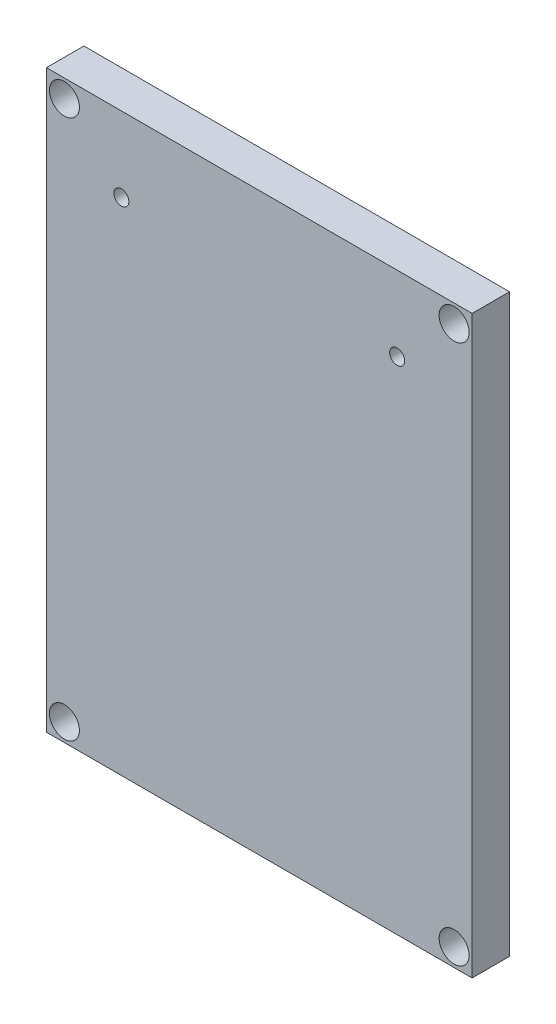
ISO-10303-21;
HEADER;
FILE_DESCRIPTION(('STEP AP214'),'2;1');
FILE_NAME('part.step','',(''),(''),'','','');
FILE_SCHEMA(('AUTOMOTIVE_DESIGN { 1 0 10303 214 1 1 1 1 }'));
ENDSEC;
DATA;
#1=APPLICATION_CONTEXT('core data for automotive mechanical design processes');
#2=APPLICATION_PROTOCOL_DEFINITION('international standard','automotive_design',2000,#1);
#3=PRODUCT_CONTEXT('',#1,'mechanical');
#4=PRODUCT('Part','Part','',(#3));
#5=PRODUCT_RELATED_PRODUCT_CATEGORY('part','',(#4));
#6=PRODUCT_DEFINITION_FORMATION('','',#4);
#7=PRODUCT_DEFINITION_CONTEXT('part definition',#1,'design');
#8=PRODUCT_DEFINITION('design','',#6,#7);
#9=PRODUCT_DEFINITION_SHAPE('','',#8);
#10=(LENGTH_UNIT() NAMED_UNIT(*) SI_UNIT(.MILLI.,.METRE.));
#11=(NAMED_UNIT(*) PLANE_ANGLE_UNIT() SI_UNIT($,.RADIAN.));
#12=(NAMED_UNIT(*) SI_UNIT($,.STERADIAN.) SOLID_ANGLE_UNIT());
#13=UNCERTAINTY_MEASURE_WITH_UNIT(LENGTH_MEASURE(1.E-05),#10,'distance_accuracy_value','');
#14=(GEOMETRIC_REPRESENTATION_CONTEXT(3) GLOBAL_UNCERTAINTY_ASSIGNED_CONTEXT((#13)) GLOBAL_UNIT_ASSIGNED_CONTEXT((#10,
#11,#12)) REPRESENTATION_CONTEXT('',''));
#15=CARTESIAN_POINT('',(0.,0.,0.));
#16=DIRECTION('',(0.,0.,1.));
#17=DIRECTION('',(1.,0.,0.));
#18=AXIS2_PLACEMENT_3D('',#15,#16,#17);
#19=CARTESIAN_POINT('',(0.,0.,6.35));
#20=DIRECTION('',(1.,0.,0.));
#21=DIRECTION('',(0.,1.,0.));
#22=AXIS2_PLACEMENT_3D('',#19,#20,#21);
#23=PLANE('',#22);
#24=DIRECTION('',(0.,-1.,0.));
#25=VECTOR('',#24,1.);
#26=CARTESIAN_POINT('',(0.,0.,0.));
#27=LINE('',#26,#25);
#28=CARTESIAN_POINT('',(0.,0.,0.));
#29=VERTEX_POINT('',#28);
#30=CARTESIAN_POINT('',(0.,-97.536,0.));
#31=VERTEX_POINT('',#30);
#32=EDGE_CURVE('E102',#29,#31,#27,.T.);
#33=ORIENTED_EDGE('',*,*,#32,.T.);
#34=DIRECTION('',(0.,0.,-1.));
#35=VECTOR('',#34,1.);
#36=CARTESIAN_POINT('',(0.,-97.536,6.35));
#37=LINE('',#36,#35);
#38=CARTESIAN_POINT('',(0.,-97.536,6.35));
#39=VERTEX_POINT('',#38);
#40=EDGE_CURVE('E11',#39,#31,#37,.T.);
#41=ORIENTED_EDGE('',*,*,#40,.F.);
#42=DIRECTION('',(0.,-1.,0.));
#43=VECTOR('',#42,1.);
#44=CARTESIAN_POINT('',(0.,0.,6.35));
#45=LINE('',#44,#43);
#46=CARTESIAN_POINT('',(0.,0.,6.35));
#47=VERTEX_POINT('',#46);
#48=EDGE_CURVE('E90',#47,#39,#45,.T.);
#49=ORIENTED_EDGE('',*,*,#48,.F.);
#50=DIRECTION('',(0.,0.,-1.));
#51=VECTOR('',#50,1.);
#52=CARTESIAN_POINT('',(0.,0.,6.35));
#53=LINE('',#52,#51);
#54=EDGE_CURVE('E98',#47,#29,#53,.T.);
#55=ORIENTED_EDGE('',*,*,#54,.T.);
#56=EDGE_LOOP('',(#33,#41,#49,#55));
#57=FACE_BOUND('',#56,.T.);
#58=ADVANCED_FACE('F39',(#57),#23,.F.);
#59=CARTESIAN_POINT('',(0.,-97.536,6.35));
#60=DIRECTION('',(0.,1.,0.));
#61=DIRECTION('',(0.,0.,1.));
#62=AXIS2_PLACEMENT_3D('',#59,#60,#61);
#63=PLANE('',#62);
#64=DIRECTION('',(1.,0.,0.));
#65=VECTOR('',#64,1.);
#66=CARTESIAN_POINT('',(0.,-97.536,0.));
#67=LINE('',#66,#65);
#68=CARTESIAN_POINT('',(72.136,-97.536,0.));
#69=VERTEX_POINT('',#68);
#70=EDGE_CURVE('E94',#31,#69,#67,.T.);
#71=ORIENTED_EDGE('',*,*,#70,.T.);
#72=DIRECTION('',(0.,0.,-1.));
#73=VECTOR('',#72,1.);
#74=CARTESIAN_POINT('',(72.136,-97.536,6.35));
#75=LINE('',#74,#73);
#76=CARTESIAN_POINT('',(72.136,-97.536,6.35));
#77=VERTEX_POINT('',#76);
#78=EDGE_CURVE('E47',#77,#69,#75,.T.);
#79=ORIENTED_EDGE('',*,*,#78,.F.);
#80=DIRECTION('',(1.,0.,0.));
#81=VECTOR('',#80,1.);
#82=CARTESIAN_POINT('',(0.,-97.536,6.35));
#83=LINE('',#82,#81);
#84=EDGE_CURVE('E85',#39,#77,#83,.T.);
#85=ORIENTED_EDGE('',*,*,#84,.F.);
#86=ORIENTED_EDGE('',*,*,#40,.T.);
#87=EDGE_LOOP('',(#71,#79,#85,#86));
#88=FACE_BOUND('',#87,.T.);
#89=ADVANCED_FACE('F93',(#88),#63,.F.);
#90=CARTESIAN_POINT('',(72.136,0.,6.35));
#91=DIRECTION('',(-1.,0.,0.));
#92=DIRECTION('',(0.,-1.,0.));
#93=AXIS2_PLACEMENT_3D('',#90,#91,#92);
#94=PLANE('',#93);
#95=DIRECTION('',(0.,1.,0.));
#96=VECTOR('',#95,1.);
#97=CARTESIAN_POINT('',(72.136,0.,0.));
#98=LINE('',#97,#96);
#99=CARTESIAN_POINT('',(72.136,0.,0.));
#100=VERTEX_POINT('',#99);
#101=EDGE_CURVE('E72',#69,#100,#98,.T.);
#102=ORIENTED_EDGE('',*,*,#101,.T.);
#103=DIRECTION('',(0.,0.,-1.));
#104=VECTOR('',#103,1.);
#105=CARTESIAN_POINT('',(72.136,0.,6.35));
#106=LINE('',#105,#104);
#107=CARTESIAN_POINT('',(72.136,0.,6.35));
#108=VERTEX_POINT('',#107);
#109=EDGE_CURVE('E95',#108,#100,#106,.T.);
#110=ORIENTED_EDGE('',*,*,#109,.F.);
#111=DIRECTION('',(0.,1.,0.));
#112=VECTOR('',#111,1.);
#113=CARTESIAN_POINT('',(72.136,0.,6.35));
#114=LINE('',#113,#112);
#115=EDGE_CURVE('E88',#77,#108,#114,.T.);
#116=ORIENTED_EDGE('',*,*,#115,.F.);
#117=ORIENTED_EDGE('',*,*,#78,.T.);
#118=EDGE_LOOP('',(#102,#110,#116,#117));
#119=FACE_BOUND('',#118,.T.);
#120=ADVANCED_FACE('F96',(#119),#94,.F.);
#121=CARTESIAN_POINT('',(0.,0.,6.35));
#122=DIRECTION('',(0.,-1.,0.));
#123=DIRECTION('',(0.,0.,-1.));
#124=AXIS2_PLACEMENT_3D('',#121,#122,#123);
#125=PLANE('',#124);
#126=DIRECTION('',(-1.,0.,0.));
#127=VECTOR('',#126,1.);
#128=CARTESIAN_POINT('',(0.,0.,0.));
#129=LINE('',#128,#127);
#130=EDGE_CURVE('E78',#100,#29,#129,.T.);
#131=ORIENTED_EDGE('',*,*,#130,.T.);
#132=ORIENTED_EDGE('',*,*,#54,.F.);
#133=DIRECTION('',(-1.,0.,0.));
#134=VECTOR('',#133,1.);
#135=CARTESIAN_POINT('',(0.,0.,6.35));
#136=LINE('',#135,#134);
#137=EDGE_CURVE('E55',#108,#47,#136,.T.);
#138=ORIENTED_EDGE('',*,*,#137,.F.);
#139=ORIENTED_EDGE('',*,*,#109,.T.);
#140=EDGE_LOOP('',(#131,#132,#138,#139));
#141=FACE_BOUND('',#140,.T.);
#142=ADVANCED_FACE('F110',(#141),#125,.F.);
#143=CARTESIAN_POINT('',(0.,0.,6.35));
#144=DIRECTION('',(0.,0.,1.));
#145=DIRECTION('',(1.,0.,0.));
#146=AXIS2_PLACEMENT_3D('',#143,#144,#145);
#147=PLANE('',#146);
#148=CARTESIAN_POINT('',(12.7,-12.7,6.35));
#149=DIRECTION('',(0.,0.,1.));
#150=DIRECTION('',(1.,0.,0.));
#151=AXIS2_PLACEMENT_3D('',#148,#149,#150);
#152=CIRCLE('',#151,1.27);
#153=CARTESIAN_POINT('',(13.97,-12.7,6.35));
#154=VERTEX_POINT('',#153);
#155=EDGE_CURVE('E146',#154,#154,#152,.T.);
#156=ORIENTED_EDGE('',*,*,#155,.F.);
#157=EDGE_LOOP('',(#156));
#158=FACE_BOUND('',#157,.T.);
#159=CARTESIAN_POINT('',(59.436,-12.7,6.35));
#160=DIRECTION('',(0.,0.,1.));
#161=DIRECTION('',(1.,0.,0.));
#162=AXIS2_PLACEMENT_3D('',#159,#160,#161);
#163=CIRCLE('',#162,1.27);
#164=CARTESIAN_POINT('',(60.706,-12.7,6.35));
#165=VERTEX_POINT('',#164);
#166=EDGE_CURVE('E143',#165,#165,#163,.T.);
#167=ORIENTED_EDGE('',*,*,#166,.F.);
#168=EDGE_LOOP('',(#167));
#169=FACE_BOUND('',#168,.T.);
#170=CARTESIAN_POINT('',(3.048,-94.488,6.35));
#171=DIRECTION('',(0.,0.,1.));
#172=DIRECTION('',(1.,0.,0.));
#173=AXIS2_PLACEMENT_3D('',#170,#171,#172);
#174=CIRCLE('',#173,2.54);
#175=CARTESIAN_POINT('',(5.588,-94.488,6.35));
#176=VERTEX_POINT('',#175);
#177=EDGE_CURVE('E122',#176,#176,#174,.T.);
#178=ORIENTED_EDGE('',*,*,#177,.F.);
#179=EDGE_LOOP('',(#178));
#180=FACE_BOUND('',#179,.T.);
#181=CARTESIAN_POINT('',(69.088,-94.488,6.35));
#182=DIRECTION('',(0.,0.,1.));
#183=DIRECTION('',(1.,0.,0.));
#184=AXIS2_PLACEMENT_3D('',#181,#182,#183);
#185=CIRCLE('',#184,2.53999999999999);
#186=CARTESIAN_POINT('',(71.628,-94.488,6.35));
#187=VERTEX_POINT('',#186);
#188=EDGE_CURVE('E130',#187,#187,#185,.T.);
#189=ORIENTED_EDGE('',*,*,#188,.F.);
#190=EDGE_LOOP('',(#189));
#191=FACE_BOUND('',#190,.T.);
#192=CARTESIAN_POINT('',(69.088,-3.048,6.35));
#193=DIRECTION('',(0.,0.,1.));
#194=DIRECTION('',(1.,0.,0.));
#195=AXIS2_PLACEMENT_3D('',#192,#193,#194);
#196=CIRCLE('',#195,2.54);
#197=CARTESIAN_POINT('',(71.628,-3.048,6.35));
#198=VERTEX_POINT('',#197);
#199=EDGE_CURVE('E121',#198,#198,#196,.T.);
#200=ORIENTED_EDGE('',*,*,#199,.F.);
#201=EDGE_LOOP('',(#200));
#202=FACE_BOUND('',#201,.T.);
#203=CARTESIAN_POINT('',(3.048,-3.048,6.35));
#204=DIRECTION('',(0.,0.,1.));
#205=DIRECTION('',(1.,0.,0.));
#206=AXIS2_PLACEMENT_3D('',#203,#204,#205);
#207=CIRCLE('',#206,2.54);
#208=CARTESIAN_POINT('',(5.588,-3.048,6.35));
#209=VERTEX_POINT('',#208);
#210=EDGE_CURVE('E118',#209,#209,#207,.T.);
#211=ORIENTED_EDGE('',*,*,#210,.F.);
#212=EDGE_LOOP('',(#211));
#213=FACE_BOUND('',#212,.T.);
#214=ORIENTED_EDGE('',*,*,#48,.T.);
#215=ORIENTED_EDGE('',*,*,#84,.T.);
#216=ORIENTED_EDGE('',*,*,#115,.T.);
#217=ORIENTED_EDGE('',*,*,#137,.T.);
#218=EDGE_LOOP('',(#214,#215,#216,#217));
#219=FACE_BOUND('',#218,.T.);
#220=ADVANCED_FACE('F86',(#158,#169,#180,#191,#202,#213,#219),#147,.T.);
#221=CARTESIAN_POINT('',(0.,0.,0.));
#222=DIRECTION('',(0.,0.,1.));
#223=DIRECTION('',(1.,0.,0.));
#224=AXIS2_PLACEMENT_3D('',#221,#222,#223);
#225=PLANE('',#224);
#226=CARTESIAN_POINT('',(3.048,-94.488,0.));
#227=DIRECTION('',(0.,0.,1.));
#228=DIRECTION('',(1.,0.,0.));
#229=AXIS2_PLACEMENT_3D('',#226,#227,#228);
#230=CIRCLE('',#229,2.54);
#231=CARTESIAN_POINT('',(5.588,-94.488,0.));
#232=VERTEX_POINT('',#231);
#233=EDGE_CURVE('E126',#232,#232,#230,.F.);
#234=ORIENTED_EDGE('',*,*,#233,.F.);
#235=EDGE_LOOP('',(#234));
#236=FACE_BOUND('',#235,.T.);
#237=CARTESIAN_POINT('',(69.088,-94.488,0.));
#238=DIRECTION('',(0.,0.,1.));
#239=DIRECTION('',(1.,0.,0.));
#240=AXIS2_PLACEMENT_3D('',#237,#238,#239);
#241=CIRCLE('',#240,2.53999999999999);
#242=CARTESIAN_POINT('',(71.628,-94.488,0.));
#243=VERTEX_POINT('',#242);
#244=EDGE_CURVE('E125',#243,#243,#241,.F.);
#245=ORIENTED_EDGE('',*,*,#244,.F.);
#246=EDGE_LOOP('',(#245));
#247=FACE_BOUND('',#246,.T.);
#248=CARTESIAN_POINT('',(69.088,-3.048,0.));
#249=DIRECTION('',(0.,0.,1.));
#250=DIRECTION('',(1.,0.,0.));
#251=AXIS2_PLACEMENT_3D('',#248,#249,#250);
#252=CIRCLE('',#251,2.54);
#253=CARTESIAN_POINT('',(71.628,-3.048,0.));
#254=VERTEX_POINT('',#253);
#255=EDGE_CURVE('E133',#254,#254,#252,.F.);
#256=ORIENTED_EDGE('',*,*,#255,.F.);
#257=EDGE_LOOP('',(#256));
#258=FACE_BOUND('',#257,.T.);
#259=CARTESIAN_POINT('',(3.048,-3.048,0.));
#260=DIRECTION('',(0.,0.,1.));
#261=DIRECTION('',(1.,0.,0.));
#262=AXIS2_PLACEMENT_3D('',#259,#260,#261);
#263=CIRCLE('',#262,2.54);
#264=CARTESIAN_POINT('',(5.588,-3.048,0.));
#265=VERTEX_POINT('',#264);
#266=EDGE_CURVE('E105',#265,#265,#263,.F.);
#267=ORIENTED_EDGE('',*,*,#266,.F.);
#268=EDGE_LOOP('',(#267));
#269=FACE_BOUND('',#268,.T.);
#270=ORIENTED_EDGE('',*,*,#32,.F.);
#271=ORIENTED_EDGE('',*,*,#130,.F.);
#272=ORIENTED_EDGE('',*,*,#101,.F.);
#273=ORIENTED_EDGE('',*,*,#70,.F.);
#274=EDGE_LOOP('',(#270,#271,#272,#273));
#275=FACE_BOUND('',#274,.T.);
#276=ADVANCED_FACE('F113',(#236,#247,#258,#269,#275),#225,.F.);
#277=CARTESIAN_POINT('',(3.048,-3.048,-0.00100000000000013));
#278=DIRECTION('',(0.,0.,1.));
#279=DIRECTION('',(1.,0.,0.));
#280=AXIS2_PLACEMENT_3D('',#277,#278,#279);
#281=CYLINDRICAL_SURFACE('',#280,2.54);
#282=ORIENTED_EDGE('',*,*,#210,.T.);
#283=EDGE_LOOP('',(#282));
#284=FACE_BOUND('',#283,.T.);
#285=ORIENTED_EDGE('',*,*,#266,.T.);
#286=EDGE_LOOP('',(#285));
#287=FACE_BOUND('',#286,.T.);
#288=ADVANCED_FACE('F174',(#284,#287),#281,.F.);
#289=CARTESIAN_POINT('',(69.088,-3.048,-0.00100000000000013));
#290=DIRECTION('',(0.,0.,1.));
#291=DIRECTION('',(1.,0.,0.));
#292=AXIS2_PLACEMENT_3D('',#289,#290,#291);
#293=CYLINDRICAL_SURFACE('',#292,2.54);
#294=ORIENTED_EDGE('',*,*,#199,.T.);
#295=EDGE_LOOP('',(#294));
#296=FACE_BOUND('',#295,.T.);
#297=ORIENTED_EDGE('',*,*,#255,.T.);
#298=EDGE_LOOP('',(#297));
#299=FACE_BOUND('',#298,.T.);
#300=ADVANCED_FACE('F177',(#296,#299),#293,.F.);
#301=CARTESIAN_POINT('',(69.088,-94.488,-0.00100000000000013));
#302=DIRECTION('',(0.,0.,1.));
#303=DIRECTION('',(1.,0.,0.));
#304=AXIS2_PLACEMENT_3D('',#301,#302,#303);
#305=CYLINDRICAL_SURFACE('',#304,2.53999999999999);
#306=ORIENTED_EDGE('',*,*,#188,.T.);
#307=EDGE_LOOP('',(#306));
#308=FACE_BOUND('',#307,.T.);
#309=ORIENTED_EDGE('',*,*,#244,.T.);
#310=EDGE_LOOP('',(#309));
#311=FACE_BOUND('',#310,.T.);
#312=ADVANCED_FACE('F237',(#308,#311),#305,.F.);
#313=CARTESIAN_POINT('',(3.048,-94.488,-0.00100000000000013));
#314=DIRECTION('',(0.,0.,1.));
#315=DIRECTION('',(1.,0.,0.));
#316=AXIS2_PLACEMENT_3D('',#313,#314,#315);
#317=CYLINDRICAL_SURFACE('',#316,2.54);
#318=ORIENTED_EDGE('',*,*,#177,.T.);
#319=EDGE_LOOP('',(#318));
#320=FACE_BOUND('',#319,.T.);
#321=ORIENTED_EDGE('',*,*,#233,.T.);
#322=EDGE_LOOP('',(#321));
#323=FACE_BOUND('',#322,.T.);
#324=ADVANCED_FACE('F246',(#320,#323),#317,.F.);
#325=CARTESIAN_POINT('',(59.436,-12.7,2.54));
#326=DIRECTION('',(0.,0.,1.));
#327=DIRECTION('',(1.,0.,0.));
#328=AXIS2_PLACEMENT_3D('',#325,#326,#327);
#329=CYLINDRICAL_SURFACE('',#328,1.27);
#330=CARTESIAN_POINT('',(59.436,-12.7,2.54));
#331=DIRECTION('',(0.,0.,1.));
#332=DIRECTION('',(1.,0.,0.));
#333=AXIS2_PLACEMENT_3D('',#330,#331,#332);
#334=CIRCLE('',#333,1.27);
#335=CARTESIAN_POINT('',(60.706,-12.7,2.54));
#336=VERTEX_POINT('',#335);
#337=EDGE_CURVE('E140',#336,#336,#334,.T.);
#338=CARTESIAN_POINT('',(60.706,-12.7,2.54));
#339=CARTESIAN_POINT('',(60.706,-12.7,2.5796875));
#340=CARTESIAN_POINT('',(60.706,-12.7,2.619375));
#341=CARTESIAN_POINT('',(60.706,-12.7,2.69875));
#342=CARTESIAN_POINT('',(60.706,-12.7,2.7384375));
#343=CARTESIAN_POINT('',(60.706,-12.7,2.8178125));
#344=CARTESIAN_POINT('',(60.706,-12.7,2.8575));
#345=CARTESIAN_POINT('',(60.706,-12.7,2.936875));
#346=CARTESIAN_POINT('',(60.706,-12.7,2.9765625));
#347=CARTESIAN_POINT('',(60.706,-12.7,3.0559375));
#348=CARTESIAN_POINT('',(60.706,-12.7,3.095625));
#349=CARTESIAN_POINT('',(60.706,-12.7,3.175));
#350=CARTESIAN_POINT('',(60.706,-12.7,3.2146875));
#351=CARTESIAN_POINT('',(60.706,-12.7,3.2940625));
#352=CARTESIAN_POINT('',(60.706,-12.7,3.33375));
#353=CARTESIAN_POINT('',(60.706,-12.7,3.413125));
#354=CARTESIAN_POINT('',(60.706,-12.7,3.4528125));
#355=CARTESIAN_POINT('',(60.706,-12.7,3.5321875));
#356=CARTESIAN_POINT('',(60.706,-12.7,3.571875));
#357=CARTESIAN_POINT('',(60.706,-12.7,3.65125));
#358=CARTESIAN_POINT('',(60.706,-12.7,3.6909375));
#359=CARTESIAN_POINT('',(60.706,-12.7,3.7703125));
#360=CARTESIAN_POINT('',(60.706,-12.7,3.81));
#361=CARTESIAN_POINT('',(60.706,-12.7,3.889375));
#362=CARTESIAN_POINT('',(60.706,-12.7,3.9290625));
#363=CARTESIAN_POINT('',(60.706,-12.7,4.0084375));
#364=CARTESIAN_POINT('',(60.706,-12.7,4.048125));
#365=CARTESIAN_POINT('',(60.706,-12.7,4.1275));
#366=CARTESIAN_POINT('',(60.706,-12.7,4.1671875));
#367=CARTESIAN_POINT('',(60.706,-12.7,4.2465625));
#368=CARTESIAN_POINT('',(60.706,-12.7,4.28625));
#369=CARTESIAN_POINT('',(60.706,-12.7,4.365625));
#370=CARTESIAN_POINT('',(60.706,-12.7,4.4053125));
#371=CARTESIAN_POINT('',(60.706,-12.7,4.4846875));
#372=CARTESIAN_POINT('',(60.706,-12.7,4.524375));
#373=CARTESIAN_POINT('',(60.706,-12.7,4.60375));
#374=CARTESIAN_POINT('',(60.706,-12.7,4.6434375));
#375=CARTESIAN_POINT('',(60.706,-12.7,4.7228125));
#376=CARTESIAN_POINT('',(60.706,-12.7,4.7625));
#377=CARTESIAN_POINT('',(60.706,-12.7,4.841875));
#378=CARTESIAN_POINT('',(60.706,-12.7,4.8815625));
#379=CARTESIAN_POINT('',(60.706,-12.7,4.9609375));
#380=CARTESIAN_POINT('',(60.706,-12.7,5.000625));
#381=CARTESIAN_POINT('',(60.706,-12.7,5.08));
#382=CARTESIAN_POINT('',(60.706,-12.7,5.1196875));
#383=CARTESIAN_POINT('',(60.706,-12.7,5.1990625));
#384=CARTESIAN_POINT('',(60.706,-12.7,5.23875));
#385=CARTESIAN_POINT('',(60.706,-12.7,5.318125));
#386=CARTESIAN_POINT('',(60.706,-12.7,5.3578125));
#387=CARTESIAN_POINT('',(60.706,-12.7,5.4371875));
#388=CARTESIAN_POINT('',(60.706,-12.7,5.476875));
#389=CARTESIAN_POINT('',(60.706,-12.7,5.55625));
#390=CARTESIAN_POINT('',(60.706,-12.7,5.5959375));
#391=CARTESIAN_POINT('',(60.706,-12.7,5.6753125));
#392=CARTESIAN_POINT('',(60.706,-12.7,5.715));
#393=CARTESIAN_POINT('',(60.706,-12.7,5.794375));
#394=CARTESIAN_POINT('',(60.706,-12.7,5.8340625));
#395=CARTESIAN_POINT('',(60.706,-12.7,5.9134375));
#396=CARTESIAN_POINT('',(60.706,-12.7,5.953125));
#397=CARTESIAN_POINT('',(60.706,-12.7,6.0325));
#398=CARTESIAN_POINT('',(60.706,-12.7,6.0721875));
#399=CARTESIAN_POINT('',(60.706,-12.7,6.1515625));
#400=CARTESIAN_POINT('',(60.706,-12.7,6.19125));
#401=CARTESIAN_POINT('',(60.706,-12.7,6.270625));
#402=CARTESIAN_POINT('',(60.706,-12.7,6.3103125));
#403=CARTESIAN_POINT('',(60.706,-12.7,6.35));
#404=B_SPLINE_CURVE_WITH_KNOTS('',3,(#338,#339,#340,#341,#342,#343,#344,#345,#346,#347,#348,
#349,#350,#351,#352,#353,#354,#355,#356,#357,#358,#359,#360,#361,#362,#363,#364,#365,#366,#367,
#368,#369,#370,#371,#372,#373,#374,#375,#376,#377,#378,#379,#380,#381,#382,#383,#384,#385,#386,
#387,#388,#389,#390,#391,#392,#393,#394,#395,#396,#397,#398,#399,#400,#401,#402,#403),
.UNSPECIFIED.,.F.,.F.,(4,2,2,2,2,2,2,2,2,2,2,2,2,2,2,2,2,2,2,2,2,2,2,2,2,2,2,2,2,2,2,2,4),(0.,
0.1190625,0.238125,0.3571875,0.47625,0.5953125,0.714375,0.8334375,0.9525,1.0715625,1.190625,
1.3096875,1.42875,1.5478125,1.666875,1.7859375,1.905,2.0240625,2.143125,2.2621875,2.38125,
2.5003125,2.619375,2.7384375,2.8575,2.9765625,3.095625,3.2146875,3.33375,3.4528125,3.571875,
3.6909375,3.81),.UNSPECIFIED.);
#405=EDGE_CURVE('BSEAM255',#336,#165,#404,.T.);
#406=ORIENTED_EDGE('',*,*,#337,.F.);
#407=ORIENTED_EDGE('',*,*,#166,.T.);
#408=ORIENTED_EDGE('',*,*,#405,.T.);
#409=ORIENTED_EDGE('',*,*,#405,.F.);
#410=EDGE_LOOP('',(#406,#408,#407,#409));
#411=FACE_BOUND('',#410,.T.);
#412=ADVANCED_FACE('F255',(#411),#329,.F.);
#413=CARTESIAN_POINT('',(59.436,-12.7,2.54));
#414=DIRECTION('',(0.,0.,1.));
#415=DIRECTION('',(1.,0.,0.));
#416=AXIS2_PLACEMENT_3D('',#413,#414,#415);
#417=PLANE('',#416);
#418=ORIENTED_EDGE('',*,*,#337,.T.);
#419=EDGE_LOOP('',(#418));
#420=FACE_BOUND('',#419,.T.);
#421=ADVANCED_FACE('F157',(#420),#417,.T.);
#422=CARTESIAN_POINT('',(12.7,-12.7,2.54));
#423=DIRECTION('',(0.,0.,1.));
#424=DIRECTION('',(1.,0.,0.));
#425=AXIS2_PLACEMENT_3D('',#422,#423,#424);
#426=CYLINDRICAL_SURFACE('',#425,1.27);
#427=CARTESIAN_POINT('',(12.7,-12.7,2.54));
#428=DIRECTION('',(0.,0.,1.));
#429=DIRECTION('',(1.,0.,0.));
#430=AXIS2_PLACEMENT_3D('',#427,#428,#429);
#431=CIRCLE('',#430,1.27);
#432=CARTESIAN_POINT('',(13.97,-12.7,2.54));
#433=VERTEX_POINT('',#432);
#434=EDGE_CURVE('E129',#433,#433,#431,.T.);
#435=CARTESIAN_POINT('',(13.97,-12.7,2.54));
#436=CARTESIAN_POINT('',(13.97,-12.7,2.5796875));
#437=CARTESIAN_POINT('',(13.97,-12.7,2.619375));
#438=CARTESIAN_POINT('',(13.97,-12.7,2.69875));
#439=CARTESIAN_POINT('',(13.97,-12.7,2.7384375));
#440=CARTESIAN_POINT('',(13.97,-12.7,2.8178125));
#441=CARTESIAN_POINT('',(13.97,-12.7,2.8575));
#442=CARTESIAN_POINT('',(13.97,-12.7,2.936875));
#443=CARTESIAN_POINT('',(13.97,-12.7,2.9765625));
#444=CARTESIAN_POINT('',(13.97,-12.7,3.0559375));
#445=CARTESIAN_POINT('',(13.97,-12.7,3.095625));
#446=CARTESIAN_POINT('',(13.97,-12.7,3.175));
#447=CARTESIAN_POINT('',(13.97,-12.7,3.2146875));
#448=CARTESIAN_POINT('',(13.97,-12.7,3.2940625));
#449=CARTESIAN_POINT('',(13.97,-12.7,3.33375));
#450=CARTESIAN_POINT('',(13.97,-12.7,3.413125));
#451=CARTESIAN_POINT('',(13.97,-12.7,3.4528125));
#452=CARTESIAN_POINT('',(13.97,-12.7,3.5321875));
#453=CARTESIAN_POINT('',(13.97,-12.7,3.571875));
#454=CARTESIAN_POINT('',(13.97,-12.7,3.65125));
#455=CARTESIAN_POINT('',(13.97,-12.7,3.6909375));
#456=CARTESIAN_POINT('',(13.97,-12.7,3.7703125));
#457=CARTESIAN_POINT('',(13.97,-12.7,3.81));
#458=CARTESIAN_POINT('',(13.97,-12.7,3.889375));
#459=CARTESIAN_POINT('',(13.97,-12.7,3.9290625));
#460=CARTESIAN_POINT('',(13.97,-12.7,4.0084375));
#461=CARTESIAN_POINT('',(13.97,-12.7,4.048125));
#462=CARTESIAN_POINT('',(13.97,-12.7,4.1275));
#463=CARTESIAN_POINT('',(13.97,-12.7,4.1671875));
#464=CARTESIAN_POINT('',(13.97,-12.7,4.2465625));
#465=CARTESIAN_POINT('',(13.97,-12.7,4.28625));
#466=CARTESIAN_POINT('',(13.97,-12.7,4.365625));
#467=CARTESIAN_POINT('',(13.97,-12.7,4.4053125));
#468=CARTESIAN_POINT('',(13.97,-12.7,4.4846875));
#469=CARTESIAN_POINT('',(13.97,-12.7,4.524375));
#470=CARTESIAN_POINT('',(13.97,-12.7,4.60375));
#471=CARTESIAN_POINT('',(13.97,-12.7,4.6434375));
#472=CARTESIAN_POINT('',(13.97,-12.7,4.7228125));
#473=CARTESIAN_POINT('',(13.97,-12.7,4.7625));
#474=CARTESIAN_POINT('',(13.97,-12.7,4.841875));
#475=CARTESIAN_POINT('',(13.97,-12.7,4.8815625));
#476=CARTESIAN_POINT('',(13.97,-12.7,4.9609375));
#477=CARTESIAN_POINT('',(13.97,-12.7,5.000625));
#478=CARTESIAN_POINT('',(13.97,-12.7,5.08));
#479=CARTESIAN_POINT('',(13.97,-12.7,5.1196875));
#480=CARTESIAN_POINT('',(13.97,-12.7,5.1990625));
#481=CARTESIAN_POINT('',(13.97,-12.7,5.23875));
#482=CARTESIAN_POINT('',(13.97,-12.7,5.318125));
#483=CARTESIAN_POINT('',(13.97,-12.7,5.3578125));
#484=CARTESIAN_POINT('',(13.97,-12.7,5.4371875));
#485=CARTESIAN_POINT('',(13.97,-12.7,5.476875));
#486=CARTESIAN_POINT('',(13.97,-12.7,5.55625));
#487=CARTESIAN_POINT('',(13.97,-12.7,5.5959375));
#488=CARTESIAN_POINT('',(13.97,-12.7,5.6753125));
#489=CARTESIAN_POINT('',(13.97,-12.7,5.715));
#490=CARTESIAN_POINT('',(13.97,-12.7,5.794375));
#491=CARTESIAN_POINT('',(13.97,-12.7,5.8340625));
#492=CARTESIAN_POINT('',(13.97,-12.7,5.9134375));
#493=CARTESIAN_POINT('',(13.97,-12.7,5.953125));
#494=CARTESIAN_POINT('',(13.97,-12.7,6.0325));
#495=CARTESIAN_POINT('',(13.97,-12.7,6.0721875));
#496=CARTESIAN_POINT('',(13.97,-12.7,6.1515625));
#497=CARTESIAN_POINT('',(13.97,-12.7,6.19125));
#498=CARTESIAN_POINT('',(13.97,-12.7,6.270625));
#499=CARTESIAN_POINT('',(13.97,-12.7,6.3103125));
#500=CARTESIAN_POINT('',(13.97,-12.7,6.35));
#501=B_SPLINE_CURVE_WITH_KNOTS('',3,(#435,#436,#437,#438,#439,#440,#441,#442,#443,#444,#445,
#446,#447,#448,#449,#450,#451,#452,#453,#454,#455,#456,#457,#458,#459,#460,#461,#462,#463,#464,
#465,#466,#467,#468,#469,#470,#471,#472,#473,#474,#475,#476,#477,#478,#479,#480,#481,#482,#483,
#484,#485,#486,#487,#488,#489,#490,#491,#492,#493,#494,#495,#496,#497,#498,#499,#500),
.UNSPECIFIED.,.F.,.F.,(4,2,2,2,2,2,2,2,2,2,2,2,2,2,2,2,2,2,2,2,2,2,2,2,2,2,2,2,2,2,2,2,4),(0.,
0.1190625,0.238125,0.3571875,0.47625,0.5953125,0.714375,0.8334375,0.9525,1.0715625,1.190625,
1.3096875,1.42875,1.5478125,1.666875,1.7859375,1.905,2.0240625,2.143125,2.2621875,2.38125,
2.5003125,2.619375,2.7384375,2.8575,2.9765625,3.095625,3.2146875,3.33375,3.4528125,3.571875,
3.6909375,3.81),.UNSPECIFIED.);
#502=EDGE_CURVE('BSEAM154',#433,#154,#501,.T.);
#503=ORIENTED_EDGE('',*,*,#434,.F.);
#504=ORIENTED_EDGE('',*,*,#155,.T.);
#505=ORIENTED_EDGE('',*,*,#502,.T.);
#506=ORIENTED_EDGE('',*,*,#502,.F.);
#507=EDGE_LOOP('',(#503,#505,#504,#506));
#508=FACE_BOUND('',#507,.T.);
#509=ADVANCED_FACE('F154',(#508),#426,.F.);
#510=CARTESIAN_POINT('',(12.7,-12.7,2.54));
#511=DIRECTION('',(0.,0.,1.));
#512=DIRECTION('',(1.,0.,0.));
#513=AXIS2_PLACEMENT_3D('',#510,#511,#512);
#514=PLANE('',#513);
#515=ORIENTED_EDGE('',*,*,#434,.T.);
#516=EDGE_LOOP('',(#515));
#517=FACE_BOUND('',#516,.T.);
#518=ADVANCED_FACE('F152',(#517),#514,.T.);
#519=CLOSED_SHELL('',(#58,#89,#120,#142,#220,#276,#288,#300,#312,#324,#412,#421,#509,#518));
#520=MANIFOLD_SOLID_BREP('B2',#519);
#521=ADVANCED_BREP_SHAPE_REPRESENTATION('',(#18,#520),#14);
#522=SHAPE_DEFINITION_REPRESENTATION(#9,#521);
ENDSEC;
END-ISO-10303-21;
